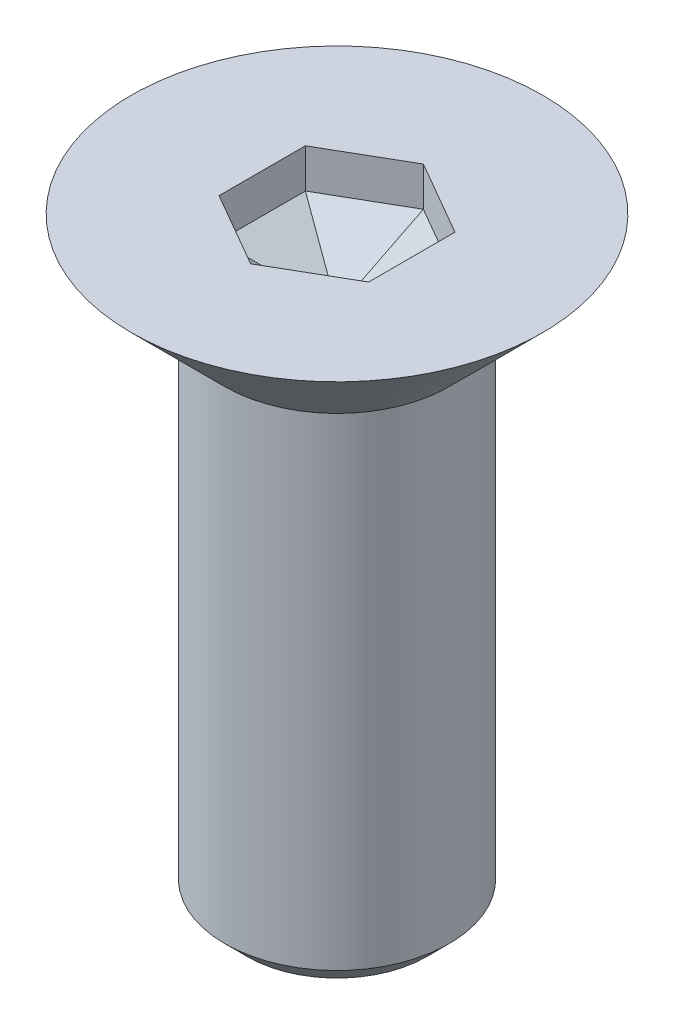
ISO-10303-21;
HEADER;
FILE_DESCRIPTION(('STEP AP214'),'2;1');
FILE_NAME('part.step','',(''),(''),'','','');
FILE_SCHEMA(('AUTOMOTIVE_DESIGN { 1 0 10303 214 1 1 1 1 }'));
ENDSEC;
DATA;
#1=APPLICATION_CONTEXT('core data for automotive mechanical design processes');
#2=APPLICATION_PROTOCOL_DEFINITION('international standard','automotive_design',2000,#1);
#3=PRODUCT_CONTEXT('',#1,'mechanical');
#4=PRODUCT('Part','Part','',(#3));
#5=PRODUCT_RELATED_PRODUCT_CATEGORY('part','',(#4));
#6=PRODUCT_DEFINITION_FORMATION('','',#4);
#7=PRODUCT_DEFINITION_CONTEXT('part definition',#1,'design');
#8=PRODUCT_DEFINITION('design','',#6,#7);
#9=PRODUCT_DEFINITION_SHAPE('','',#8);
#10=(LENGTH_UNIT() NAMED_UNIT(*) SI_UNIT(.MILLI.,.METRE.));
#11=(NAMED_UNIT(*) PLANE_ANGLE_UNIT() SI_UNIT($,.RADIAN.));
#12=(NAMED_UNIT(*) SI_UNIT($,.STERADIAN.) SOLID_ANGLE_UNIT());
#13=UNCERTAINTY_MEASURE_WITH_UNIT(LENGTH_MEASURE(1.E-05),#10,'distance_accuracy_value','');
#14=(GEOMETRIC_REPRESENTATION_CONTEXT(3) GLOBAL_UNCERTAINTY_ASSIGNED_CONTEXT((#13)) GLOBAL_UNIT_ASSIGNED_CONTEXT((#10,
#11,#12)) REPRESENTATION_CONTEXT('',''));
#15=CARTESIAN_POINT('',(0.,0.,0.));
#16=DIRECTION('',(0.,0.,1.));
#17=DIRECTION('',(1.,0.,0.));
#18=AXIS2_PLACEMENT_3D('',#15,#16,#17);
#19=CARTESIAN_POINT('',(0.,-1.86,0.));
#20=DIRECTION('',(0.,1.,0.));
#21=DIRECTION('',(0.,0.,1.));
#22=AXIS2_PLACEMENT_3D('',#19,#20,#21);
#23=CONICAL_SURFACE('',#22,0.89000000000002,0.785398163397443);
#24=CARTESIAN_POINT('',(0.,0.,0.));
#25=DIRECTION('',(0.,-1.,0.));
#26=DIRECTION('',(0.,0.,-1.));
#27=AXIS2_PLACEMENT_3D('',#24,#25,#26);
#28=CIRCLE('',#27,2.75);
#29=CARTESIAN_POINT('',(0.,0.,-2.75));
#30=VERTEX_POINT('',#29);
#31=EDGE_CURVE('E172',#30,#30,#28,.T.);
#32=ORIENTED_EDGE('',*,*,#31,.T.);
#33=EDGE_LOOP('',(#32));
#34=FACE_BOUND('',#33,.T.);
#35=CARTESIAN_POINT('',(0.,-1.25000000000001,0.));
#36=DIRECTION('',(0.,1.,0.));
#37=DIRECTION('',(0.,0.,1.));
#38=AXIS2_PLACEMENT_3D('',#35,#36,#37);
#39=CIRCLE('',#38,1.5);
#40=CARTESIAN_POINT('',(0.,-1.25000000000001,1.5));
#41=VERTEX_POINT('',#40);
#42=EDGE_CURVE('E161',#41,#41,#39,.T.);
#43=ORIENTED_EDGE('',*,*,#42,.T.);
#44=EDGE_LOOP('',(#43));
#45=FACE_BOUND('',#44,.T.);
#46=ADVANCED_FACE('F45',(#34,#45),#23,.T.);
#47=CARTESIAN_POINT('',(0.,0.,0.));
#48=DIRECTION('',(0.,1.,0.));
#49=DIRECTION('',(0.,0.,1.));
#50=AXIS2_PLACEMENT_3D('',#47,#48,#49);
#51=PLANE('',#50);
#52=DIRECTION('',(0.,0.,-1.));
#53=VECTOR('',#52,1.);
#54=CARTESIAN_POINT('',(1.,0.,0.577350269189626));
#55=LINE('',#54,#53);
#56=CARTESIAN_POINT('',(1.,0.,0.577350269189626));
#57=VERTEX_POINT('',#56);
#58=CARTESIAN_POINT('',(1.,0.,-0.577350269189626));
#59=VERTEX_POINT('',#58);
#60=EDGE_CURVE('E137',#57,#59,#55,.T.);
#61=ORIENTED_EDGE('',*,*,#60,.F.);
#62=DIRECTION('',(0.866025403784439,0.,-0.5));
#63=VECTOR('',#62,1.);
#64=CARTESIAN_POINT('',(0.,0.,1.15470053837925));
#65=LINE('',#64,#63);
#66=CARTESIAN_POINT('',(0.,0.,1.15470053837925));
#67=VERTEX_POINT('',#66);
#68=EDGE_CURVE('E154',#67,#57,#65,.T.);
#69=ORIENTED_EDGE('',*,*,#68,.F.);
#70=DIRECTION('',(0.866025403784439,0.,0.5));
#71=VECTOR('',#70,1.);
#72=CARTESIAN_POINT('',(-1.,0.,0.577350269189626));
#73=LINE('',#72,#71);
#74=CARTESIAN_POINT('',(-1.,0.,0.577350269189626));
#75=VERTEX_POINT('',#74);
#76=EDGE_CURVE('E147',#75,#67,#73,.T.);
#77=ORIENTED_EDGE('',*,*,#76,.F.);
#78=DIRECTION('',(0.,0.,1.));
#79=VECTOR('',#78,1.);
#80=CARTESIAN_POINT('',(-1.,0.,-0.577350269189626));
#81=LINE('',#80,#79);
#82=CARTESIAN_POINT('',(-1.,0.,-0.577350269189626));
#83=VERTEX_POINT('',#82);
#84=EDGE_CURVE('E143',#83,#75,#81,.T.);
#85=ORIENTED_EDGE('',*,*,#84,.F.);
#86=DIRECTION('',(-0.866025403784439,0.,0.5));
#87=VECTOR('',#86,1.);
#88=CARTESIAN_POINT('',(0.,0.,-1.15470053837925));
#89=LINE('',#88,#87);
#90=CARTESIAN_POINT('',(0.,0.,-1.15470053837925));
#91=VERTEX_POINT('',#90);
#92=EDGE_CURVE('E122',#91,#83,#89,.T.);
#93=ORIENTED_EDGE('',*,*,#92,.F.);
#94=DIRECTION('',(-0.866025403784438,0.,-0.5));
#95=VECTOR('',#94,1.);
#96=CARTESIAN_POINT('',(1.,0.,-0.577350269189626));
#97=LINE('',#96,#95);
#98=EDGE_CURVE('E131',#59,#91,#97,.T.);
#99=ORIENTED_EDGE('',*,*,#98,.F.);
#100=EDGE_LOOP('',(#61,#69,#77,#85,#93,#99));
#101=FACE_BOUND('',#100,.T.);
#102=ORIENTED_EDGE('',*,*,#31,.F.);
#103=EDGE_LOOP('',(#102));
#104=FACE_BOUND('',#103,.T.);
#105=ADVANCED_FACE('F139',(#101,#104),#51,.T.);
#106=CARTESIAN_POINT('',(0.,-8.,0.));
#107=DIRECTION('',(0.,1.,0.));
#108=DIRECTION('',(0.,0.,1.));
#109=AXIS2_PLACEMENT_3D('',#106,#107,#108);
#110=CYLINDRICAL_SURFACE('',#109,1.5);
#111=CARTESIAN_POINT('',(0.,-7.7,0.));
#112=DIRECTION('',(0.,-1.,0.));
#113=DIRECTION('',(0.,0.,-1.));
#114=AXIS2_PLACEMENT_3D('',#111,#112,#113);
#115=CIRCLE('',#114,1.5);
#116=CARTESIAN_POINT('',(0.,-7.7,-1.5));
#117=VERTEX_POINT('',#116);
#118=EDGE_CURVE('E11',#117,#117,#115,.F.);
#119=ORIENTED_EDGE('',*,*,#118,.T.);
#120=EDGE_LOOP('',(#119));
#121=FACE_BOUND('',#120,.T.);
#122=ORIENTED_EDGE('',*,*,#42,.F.);
#123=EDGE_LOOP('',(#122));
#124=FACE_BOUND('',#123,.T.);
#125=ADVANCED_FACE('F257',(#121,#124),#110,.T.);
#126=CARTESIAN_POINT('',(0.,-8.,0.));
#127=DIRECTION('',(0.,-1.,0.));
#128=DIRECTION('',(0.,0.,-1.));
#129=AXIS2_PLACEMENT_3D('',#126,#127,#128);
#130=PLANE('',#129);
#131=CARTESIAN_POINT('',(0.,-8.,0.));
#132=DIRECTION('',(0.,-1.,0.));
#133=DIRECTION('',(0.,0.,-1.));
#134=AXIS2_PLACEMENT_3D('',#131,#132,#133);
#135=CIRCLE('',#134,1.2);
#136=CARTESIAN_POINT('',(0.,-8.,-1.2));
#137=VERTEX_POINT('',#136);
#138=EDGE_CURVE('E54',#137,#137,#135,.T.);
#139=ORIENTED_EDGE('',*,*,#138,.T.);
#140=EDGE_LOOP('',(#139));
#141=FACE_BOUND('',#140,.T.);
#142=ADVANCED_FACE('F239',(#141),#130,.T.);
#143=CARTESIAN_POINT('',(1.,-1.1,0.577350269189626));
#144=DIRECTION('',(1.,0.,0.));
#145=DIRECTION('',(0.,0.,-1.));
#146=AXIS2_PLACEMENT_3D('',#143,#144,#145);
#147=PLANE('',#146);
#148=DIRECTION('',(0.,1.,0.));
#149=VECTOR('',#148,1.);
#150=CARTESIAN_POINT('',(1.,-1.1,-0.577350269189626));
#151=LINE('',#150,#149);
#152=CARTESIAN_POINT('',(1.,-0.523631123919308,-0.577350269189626));
#153=VERTEX_POINT('',#152);
#154=EDGE_CURVE('E128',#153,#59,#151,.T.);
#155=ORIENTED_EDGE('',*,*,#154,.F.);
#156=DIRECTION('',(0.,0.,1.));
#157=VECTOR('',#156,1.);
#158=CARTESIAN_POINT('',(1.,-0.523631123919308,0.577350269189626));
#159=LINE('',#158,#157);
#160=CARTESIAN_POINT('',(1.,-0.523631123919308,0.577350269189626));
#161=VERTEX_POINT('',#160);
#162=EDGE_CURVE('E68',#153,#161,#159,.T.);
#163=ORIENTED_EDGE('',*,*,#162,.T.);
#164=DIRECTION('',(0.,1.,0.));
#165=VECTOR('',#164,1.);
#166=CARTESIAN_POINT('',(1.,-1.1,0.577350269189626));
#167=LINE('',#166,#165);
#168=EDGE_CURVE('E158',#161,#57,#167,.T.);
#169=ORIENTED_EDGE('',*,*,#168,.T.);
#170=ORIENTED_EDGE('',*,*,#60,.T.);
#171=EDGE_LOOP('',(#155,#163,#169,#170));
#172=FACE_BOUND('',#171,.T.);
#173=ADVANCED_FACE('F311',(#172),#147,.F.);
#174=CARTESIAN_POINT('',(0.,-1.1,1.15470053837925));
#175=DIRECTION('',(0.5,0.,0.866025403784439));
#176=DIRECTION('',(0.866025403784439,0.,-0.5));
#177=AXIS2_PLACEMENT_3D('',#174,#175,#176);
#178=PLANE('',#177);
#179=ORIENTED_EDGE('',*,*,#168,.F.);
#180=DIRECTION('',(-0.866025403784439,0.,0.5));
#181=VECTOR('',#180,1.);
#182=CARTESIAN_POINT('',(0.,-0.523631123919308,1.15470053837925));
#183=LINE('',#182,#181);
#184=CARTESIAN_POINT('',(0.,-0.523631123919308,1.15470053837925));
#185=VERTEX_POINT('',#184);
#186=EDGE_CURVE('E207',#161,#185,#183,.T.);
#187=ORIENTED_EDGE('',*,*,#186,.T.);
#188=DIRECTION('',(0.,1.,0.));
#189=VECTOR('',#188,1.);
#190=CARTESIAN_POINT('',(0.,-1.1,1.15470053837925));
#191=LINE('',#190,#189);
#192=EDGE_CURVE('E162',#185,#67,#191,.T.);
#193=ORIENTED_EDGE('',*,*,#192,.T.);
#194=ORIENTED_EDGE('',*,*,#68,.T.);
#195=EDGE_LOOP('',(#179,#187,#193,#194));
#196=FACE_BOUND('',#195,.T.);
#197=ADVANCED_FACE('F296',(#196),#178,.F.);
#198=CARTESIAN_POINT('',(-1.,-1.1,0.577350269189626));
#199=DIRECTION('',(-0.5,0.,0.866025403784438));
#200=DIRECTION('',(0.866025403784439,0.,0.5));
#201=AXIS2_PLACEMENT_3D('',#198,#199,#200);
#202=PLANE('',#201);
#203=ORIENTED_EDGE('',*,*,#192,.F.);
#204=DIRECTION('',(-0.866025403784439,0.,-0.5));
#205=VECTOR('',#204,1.);
#206=CARTESIAN_POINT('',(-1.,-0.523631123919308,0.577350269189626));
#207=LINE('',#206,#205);
#208=CARTESIAN_POINT('',(-1.,-0.523631123919308,0.577350269189626));
#209=VERTEX_POINT('',#208);
#210=EDGE_CURVE('E198',#185,#209,#207,.T.);
#211=ORIENTED_EDGE('',*,*,#210,.T.);
#212=DIRECTION('',(0.,1.,0.));
#213=VECTOR('',#212,1.);
#214=CARTESIAN_POINT('',(-1.,-1.1,0.577350269189626));
#215=LINE('',#214,#213);
#216=EDGE_CURVE('E165',#209,#75,#215,.T.);
#217=ORIENTED_EDGE('',*,*,#216,.T.);
#218=ORIENTED_EDGE('',*,*,#76,.T.);
#219=EDGE_LOOP('',(#203,#211,#217,#218));
#220=FACE_BOUND('',#219,.T.);
#221=ADVANCED_FACE('F299',(#220),#202,.F.);
#222=CARTESIAN_POINT('',(-1.,-1.1,-0.577350269189626));
#223=DIRECTION('',(-1.,0.,0.));
#224=DIRECTION('',(0.,0.,1.));
#225=AXIS2_PLACEMENT_3D('',#222,#223,#224);
#226=PLANE('',#225);
#227=ORIENTED_EDGE('',*,*,#216,.F.);
#228=DIRECTION('',(0.,0.,-1.));
#229=VECTOR('',#228,1.);
#230=CARTESIAN_POINT('',(-1.,-0.523631123919308,-0.577350269189626));
#231=LINE('',#230,#229);
#232=CARTESIAN_POINT('',(-1.,-0.523631123919308,-0.577350269189626));
#233=VERTEX_POINT('',#232);
#234=EDGE_CURVE('E202',#209,#233,#231,.T.);
#235=ORIENTED_EDGE('',*,*,#234,.T.);
#236=DIRECTION('',(0.,1.,0.));
#237=VECTOR('',#236,1.);
#238=CARTESIAN_POINT('',(-1.,-1.1,-0.577350269189626));
#239=LINE('',#238,#237);
#240=EDGE_CURVE('E127',#233,#83,#239,.T.);
#241=ORIENTED_EDGE('',*,*,#240,.T.);
#242=ORIENTED_EDGE('',*,*,#84,.T.);
#243=EDGE_LOOP('',(#227,#235,#241,#242));
#244=FACE_BOUND('',#243,.T.);
#245=ADVANCED_FACE('F308',(#244),#226,.F.);
#246=CARTESIAN_POINT('',(0.,-1.1,-1.15470053837925));
#247=DIRECTION('',(-0.5,0.,-0.866025403784439));
#248=DIRECTION('',(-0.866025403784439,0.,0.5));
#249=AXIS2_PLACEMENT_3D('',#246,#247,#248);
#250=PLANE('',#249);
#251=ORIENTED_EDGE('',*,*,#240,.F.);
#252=DIRECTION('',(0.866025403784439,0.,-0.5));
#253=VECTOR('',#252,1.);
#254=CARTESIAN_POINT('',(0.,-0.523631123919308,-1.15470053837925));
#255=LINE('',#254,#253);
#256=CARTESIAN_POINT('',(0.,-0.523631123919308,-1.15470053837925));
#257=VERTEX_POINT('',#256);
#258=EDGE_CURVE('E125',#233,#257,#255,.T.);
#259=ORIENTED_EDGE('',*,*,#258,.T.);
#260=DIRECTION('',(0.,1.,0.));
#261=VECTOR('',#260,1.);
#262=CARTESIAN_POINT('',(0.,-1.1,-1.15470053837925));
#263=LINE('',#262,#261);
#264=EDGE_CURVE('E117',#257,#91,#263,.T.);
#265=ORIENTED_EDGE('',*,*,#264,.T.);
#266=ORIENTED_EDGE('',*,*,#92,.T.);
#267=EDGE_LOOP('',(#251,#259,#265,#266));
#268=FACE_BOUND('',#267,.T.);
#269=ADVANCED_FACE('F120',(#268),#250,.F.);
#270=CARTESIAN_POINT('',(1.,-1.1,-0.577350269189626));
#271=DIRECTION('',(0.5,0.,-0.866025403784439));
#272=DIRECTION('',(-0.866025403784439,0.,-0.5));
#273=AXIS2_PLACEMENT_3D('',#270,#271,#272);
#274=PLANE('',#273);
#275=ORIENTED_EDGE('',*,*,#264,.F.);
#276=DIRECTION('',(0.866025403784439,0.,0.5));
#277=VECTOR('',#276,1.);
#278=CARTESIAN_POINT('',(1.,-0.523631123919308,-0.577350269189626));
#279=LINE('',#278,#277);
#280=EDGE_CURVE('E61',#257,#153,#279,.T.);
#281=ORIENTED_EDGE('',*,*,#280,.T.);
#282=ORIENTED_EDGE('',*,*,#154,.T.);
#283=ORIENTED_EDGE('',*,*,#98,.T.);
#284=EDGE_LOOP('',(#275,#281,#282,#283));
#285=FACE_BOUND('',#284,.T.);
#286=ADVANCED_FACE('F132',(#285),#274,.F.);
#287=CARTESIAN_POINT('',(0.,-1.1,0.));
#288=DIRECTION('',(0.,1.,0.));
#289=DIRECTION('',(0.,0.,1.));
#290=AXIS2_PLACEMENT_3D('',#287,#288,#289);
#291=PLANE('',#290);
#292=DIRECTION('',(0.,0.,1.));
#293=VECTOR('',#292,1.);
#294=CARTESIAN_POINT('',(-0.00169982272685667,-1.1,0.));
#295=LINE('',#294,#293);
#296=CARTESIAN_POINT('',(-0.00169982272685669,-1.1,-0.000981393108925688));
#297=VERTEX_POINT('',#296);
#298=CARTESIAN_POINT('',(-0.00169982272685667,-1.1,0.000981393108925378));
#299=VERTEX_POINT('',#298);
#300=EDGE_CURVE('E191',#297,#299,#295,.T.);
#301=ORIENTED_EDGE('',*,*,#300,.T.);
#302=DIRECTION('',(0.866025403784439,0.,0.5));
#303=VECTOR('',#302,1.);
#304=CARTESIAN_POINT('',(-0.00084991136342836,-1.1,0.00147208966338806));
#305=LINE('',#304,#303);
#306=CARTESIAN_POINT('',(0.,-1.1,0.00196278621785082));
#307=VERTEX_POINT('',#306);
#308=EDGE_CURVE('E194',#299,#307,#305,.T.);
#309=ORIENTED_EDGE('',*,*,#308,.T.);
#310=DIRECTION('',(0.866025403784439,0.,-0.5));
#311=VECTOR('',#310,1.);
#312=CARTESIAN_POINT('',(0.000849911363428441,-1.1,0.0014720896633882));
#313=LINE('',#312,#311);
#314=CARTESIAN_POINT('',(0.00169982272685634,-1.1,0.000981393108925766));
#315=VERTEX_POINT('',#314);
#316=EDGE_CURVE('E185',#307,#315,#313,.T.);
#317=ORIENTED_EDGE('',*,*,#316,.T.);
#318=DIRECTION('',(0.,0.,-1.));
#319=VECTOR('',#318,1.);
#320=CARTESIAN_POINT('',(0.00169982272685634,-1.1,0.));
#321=LINE('',#320,#319);
#322=CARTESIAN_POINT('',(0.00169982272685634,-1.1,-0.000981393108925174));
#323=VERTEX_POINT('',#322);
#324=EDGE_CURVE('E182',#315,#323,#321,.T.);
#325=ORIENTED_EDGE('',*,*,#324,.T.);
#326=DIRECTION('',(-0.866025403784439,0.,-0.5));
#327=VECTOR('',#326,1.);
#328=CARTESIAN_POINT('',(0.00084991136342817,-1.1,-0.00147208966338773));
#329=LINE('',#328,#327);
#330=CARTESIAN_POINT('',(0.,-1.1,-0.00196278621785071));
#331=VERTEX_POINT('',#330);
#332=EDGE_CURVE('E176',#323,#331,#329,.T.);
#333=ORIENTED_EDGE('',*,*,#332,.T.);
#334=DIRECTION('',(-0.866025403784439,0.,0.5));
#335=VECTOR('',#334,1.);
#336=CARTESIAN_POINT('',(-0.000849911363428468,-1.1,-0.00147208966338824));
#337=LINE('',#336,#335);
#338=EDGE_CURVE('E188',#331,#297,#337,.T.);
#339=ORIENTED_EDGE('',*,*,#338,.T.);
#340=EDGE_LOOP('',(#301,#309,#317,#325,#333,#339));
#341=FACE_BOUND('',#340,.T.);
#342=ADVANCED_FACE('F279',(#341),#291,.T.);
#343=CARTESIAN_POINT('',(0.00084991136342817,-1.1,-0.00147208966338773));
#344=DIRECTION('',(0.249999999999997,-0.866025403784442,-0.433012701892215));
#345=DIRECTION('',(-0.866025403784439,0.,-0.5));
#346=AXIS2_PLACEMENT_3D('',#343,#344,#345);
#347=PLANE('',#346);
#348=DIRECTION('',(0.774596669241486,0.447213595499953,-0.447213595499959));
#349=VECTOR('',#348,1.);
#350=CARTESIAN_POINT('',(0.00135985818148507,-1.10019627862179,-0.000785114487140121));
#351=LINE('',#350,#349);
#352=EDGE_CURVE('E228',#153,#323,#351,.F.);
#353=ORIENTED_EDGE('',*,*,#352,.F.);
#354=ORIENTED_EDGE('',*,*,#280,.F.);
#355=DIRECTION('',(0.,-0.447213595499953,0.894427190999918));
#356=VECTOR('',#355,1.);
#357=CARTESIAN_POINT('',(0.,-1.10019627862179,-0.00157022897428072));
#358=LINE('',#357,#356);
#359=EDGE_CURVE('E232',#331,#257,#358,.F.);
#360=ORIENTED_EDGE('',*,*,#359,.F.);
#361=ORIENTED_EDGE('',*,*,#332,.F.);
#362=EDGE_LOOP('',(#353,#354,#360,#361));
#363=FACE_BOUND('',#362,.T.);
#364=ADVANCED_FACE('F276',(#363),#347,.F.);
#365=CARTESIAN_POINT('',(-0.000849911363428468,-1.1,-0.00147208966338824));
#366=DIRECTION('',(-0.249999999999997,-0.866025403784442,-0.433012701892215));
#367=DIRECTION('',(-0.866025403784439,0.,0.5));
#368=AXIS2_PLACEMENT_3D('',#365,#366,#367);
#369=PLANE('',#368);
#370=ORIENTED_EDGE('',*,*,#359,.T.);
#371=ORIENTED_EDGE('',*,*,#258,.F.);
#372=DIRECTION('',(0.774596669241485,-0.447213595499953,0.447213595499959));
#373=VECTOR('',#372,1.);
#374=CARTESIAN_POINT('',(-0.00135985818148522,-1.10019627862179,-0.000785114487140521));
#375=LINE('',#374,#373);
#376=EDGE_CURVE('E224',#297,#233,#375,.F.);
#377=ORIENTED_EDGE('',*,*,#376,.F.);
#378=ORIENTED_EDGE('',*,*,#338,.F.);
#379=EDGE_LOOP('',(#370,#371,#377,#378));
#380=FACE_BOUND('',#379,.T.);
#381=ADVANCED_FACE('F273',(#380),#369,.F.);
#382=CARTESIAN_POINT('',(0.00169982272685634,-1.1,0.));
#383=DIRECTION('',(0.499999999999995,-0.866025403784442,0.));
#384=DIRECTION('',(0.,0.,-1.));
#385=AXIS2_PLACEMENT_3D('',#382,#383,#384);
#386=PLANE('',#385);
#387=ORIENTED_EDGE('',*,*,#352,.T.);
#388=ORIENTED_EDGE('',*,*,#324,.F.);
#389=DIRECTION('',(0.774596669241486,0.447213595499953,0.447213595499959));
#390=VECTOR('',#389,1.);
#391=CARTESIAN_POINT('',(0.00135985818148517,-1.10019627862179,0.00078511448714074));
#392=LINE('',#391,#390);
#393=EDGE_CURVE('E220',#161,#315,#392,.F.);
#394=ORIENTED_EDGE('',*,*,#393,.F.);
#395=ORIENTED_EDGE('',*,*,#162,.F.);
#396=EDGE_LOOP('',(#387,#388,#394,#395));
#397=FACE_BOUND('',#396,.T.);
#398=ADVANCED_FACE('F269',(#397),#386,.F.);
#399=CARTESIAN_POINT('',(-0.00169982272685667,-1.1,0.));
#400=DIRECTION('',(-0.499999999999995,-0.866025403784442,0.));
#401=DIRECTION('',(0.,0.,1.));
#402=AXIS2_PLACEMENT_3D('',#399,#400,#401);
#403=PLANE('',#402);
#404=ORIENTED_EDGE('',*,*,#376,.T.);
#405=ORIENTED_EDGE('',*,*,#234,.F.);
#406=DIRECTION('',(0.774596669241486,-0.447213595499953,-0.447213595499959));
#407=VECTOR('',#406,1.);
#408=CARTESIAN_POINT('',(-0.00135985818148534,-1.10019627862179,0.000785114487140339));
#409=LINE('',#408,#407);
#410=EDGE_CURVE('E217',#299,#209,#409,.F.);
#411=ORIENTED_EDGE('',*,*,#410,.F.);
#412=ORIENTED_EDGE('',*,*,#300,.F.);
#413=EDGE_LOOP('',(#404,#405,#411,#412));
#414=FACE_BOUND('',#413,.T.);
#415=ADVANCED_FACE('F265',(#414),#403,.F.);
#416=CARTESIAN_POINT('',(0.000849911363428414,-1.1,0.00147208966338815));
#417=DIRECTION('',(0.249999999999997,-0.866025403784442,0.433012701892215));
#418=DIRECTION('',(0.866025403784439,0.,-0.5));
#419=AXIS2_PLACEMENT_3D('',#416,#417,#418);
#420=PLANE('',#419);
#421=ORIENTED_EDGE('',*,*,#393,.T.);
#422=ORIENTED_EDGE('',*,*,#316,.F.);
#423=DIRECTION('',(0.,0.447213595499953,0.894427190999918));
#424=VECTOR('',#423,1.);
#425=CARTESIAN_POINT('',(0.,-1.10019627862179,0.0015702289742806));
#426=LINE('',#425,#424);
#427=EDGE_CURVE('E214',#185,#307,#426,.F.);
#428=ORIENTED_EDGE('',*,*,#427,.F.);
#429=ORIENTED_EDGE('',*,*,#186,.F.);
#430=EDGE_LOOP('',(#421,#422,#428,#429));
#431=FACE_BOUND('',#430,.T.);
#432=ADVANCED_FACE('F247',(#431),#420,.F.);
#433=CARTESIAN_POINT('',(-0.00084991136342836,-1.1,0.00147208966338806));
#434=DIRECTION('',(-0.249999999999997,-0.866025403784442,0.433012701892215));
#435=DIRECTION('',(0.866025403784439,0.,0.5));
#436=AXIS2_PLACEMENT_3D('',#433,#434,#435);
#437=PLANE('',#436);
#438=ORIENTED_EDGE('',*,*,#410,.T.);
#439=ORIENTED_EDGE('',*,*,#210,.F.);
#440=ORIENTED_EDGE('',*,*,#427,.T.);
#441=ORIENTED_EDGE('',*,*,#308,.F.);
#442=EDGE_LOOP('',(#438,#439,#440,#441));
#443=FACE_BOUND('',#442,.T.);
#444=ADVANCED_FACE('F242',(#443),#437,.F.);
#445=CARTESIAN_POINT('',(0.,-8.,0.));
#446=DIRECTION('',(0.,1.,0.));
#447=DIRECTION('',(0.,0.,1.));
#448=AXIS2_PLACEMENT_3D('',#445,#446,#447);
#449=CONICAL_SURFACE('',#448,1.2,0.785398163397444);
#450=ORIENTED_EDGE('',*,*,#118,.F.);
#451=EDGE_LOOP('',(#450));
#452=FACE_BOUND('',#451,.T.);
#453=ORIENTED_EDGE('',*,*,#138,.F.);
#454=EDGE_LOOP('',(#453));
#455=FACE_BOUND('',#454,.T.);
#456=ADVANCED_FACE('F47',(#452,#455),#449,.T.);
#457=CLOSED_SHELL('',(#46,#105,#125,#142,#173,#197,#221,#245,#269,#286,#342,#364,#381,#398,#415,
#432,#444,#456));
#458=MANIFOLD_SOLID_BREP('B2',#457);
#459=ADVANCED_BREP_SHAPE_REPRESENTATION('',(#18,#458),#14);
#460=SHAPE_DEFINITION_REPRESENTATION(#9,#459);
ENDSEC;
END-ISO-10303-21;
